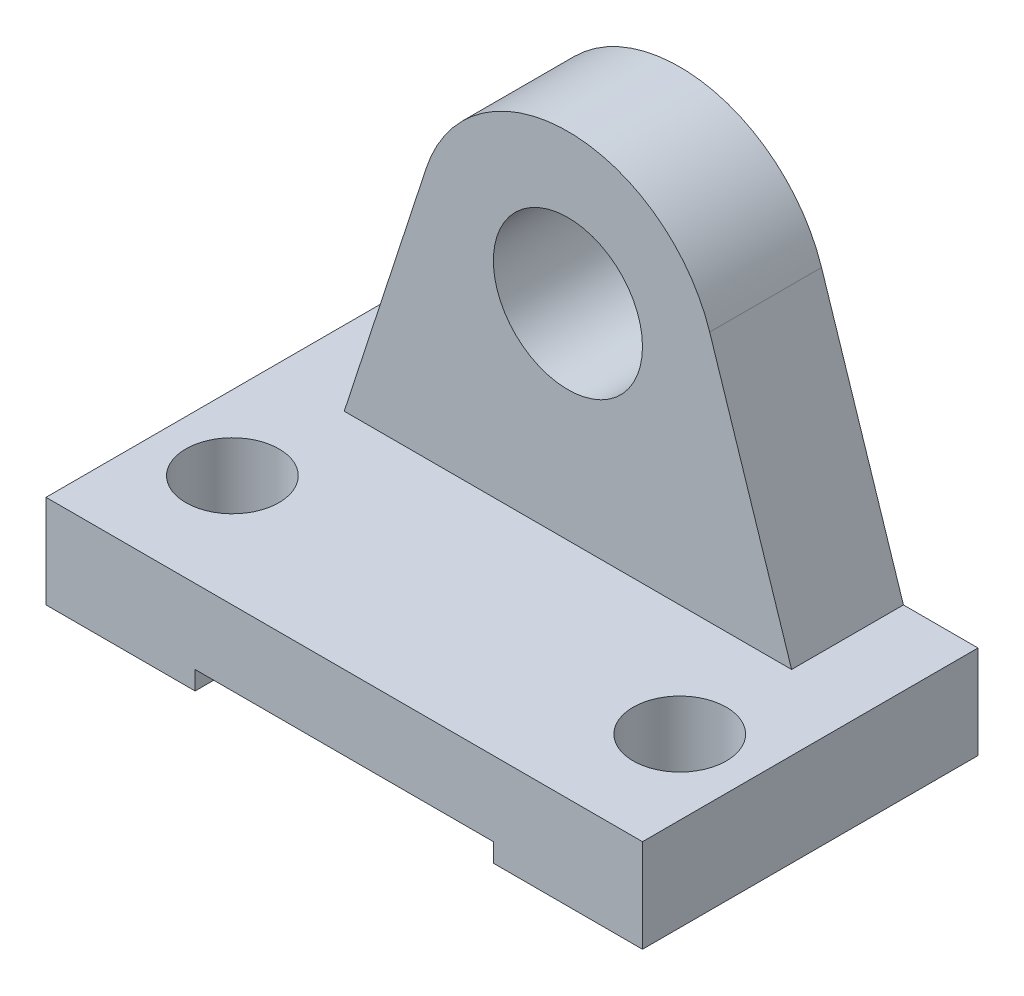
ISO-10303-21;
HEADER;
FILE_DESCRIPTION(('STEP AP214'),'2;1');
FILE_NAME('part.step','',(''),(''),'','','');
FILE_SCHEMA(('AUTOMOTIVE_DESIGN { 1 0 10303 214 1 1 1 1 }'));
ENDSEC;
DATA;
#1=APPLICATION_CONTEXT('core data for automotive mechanical design processes');
#2=APPLICATION_PROTOCOL_DEFINITION('international standard','automotive_design',2000,#1);
#3=PRODUCT_CONTEXT('',#1,'mechanical');
#4=PRODUCT('Part','Part','',(#3));
#5=PRODUCT_RELATED_PRODUCT_CATEGORY('part','',(#4));
#6=PRODUCT_DEFINITION_FORMATION('','',#4);
#7=PRODUCT_DEFINITION_CONTEXT('part definition',#1,'design');
#8=PRODUCT_DEFINITION('design','',#6,#7);
#9=PRODUCT_DEFINITION_SHAPE('','',#8);
#10=(LENGTH_UNIT() NAMED_UNIT(*) SI_UNIT(.MILLI.,.METRE.));
#11=(NAMED_UNIT(*) PLANE_ANGLE_UNIT() SI_UNIT($,.RADIAN.));
#12=(NAMED_UNIT(*) SI_UNIT($,.STERADIAN.) SOLID_ANGLE_UNIT());
#13=UNCERTAINTY_MEASURE_WITH_UNIT(LENGTH_MEASURE(1.E-05),#10,'distance_accuracy_value','');
#14=(GEOMETRIC_REPRESENTATION_CONTEXT(3) GLOBAL_UNCERTAINTY_ASSIGNED_CONTEXT((#13)) GLOBAL_UNIT_ASSIGNED_CONTEXT((#10,
#11,#12)) REPRESENTATION_CONTEXT('',''));
#15=CARTESIAN_POINT('',(0.,0.,0.));
#16=DIRECTION('',(0.,0.,1.));
#17=DIRECTION('',(1.,0.,0.));
#18=AXIS2_PLACEMENT_3D('',#15,#16,#17);
#19=CARTESIAN_POINT('',(-16.,4.,18.));
#20=DIRECTION('',(0.,1.,0.));
#21=DIRECTION('',(0.,0.,1.));
#22=AXIS2_PLACEMENT_3D('',#19,#20,#21);
#23=PLANE('',#22);
#24=CARTESIAN_POINT('',(12.,4.,12.));
#25=DIRECTION('',(0.,-1.,0.));
#26=DIRECTION('',(0.,0.,-1.));
#27=AXIS2_PLACEMENT_3D('',#24,#25,#26);
#28=CIRCLE('',#27,2.5);
#29=CARTESIAN_POINT('',(12.,4.,9.5));
#30=VERTEX_POINT('',#29);
#31=EDGE_CURVE('E352',#30,#30,#28,.T.);
#32=ORIENTED_EDGE('',*,*,#31,.T.);
#33=EDGE_LOOP('',(#32));
#34=FACE_BOUND('',#33,.T.);
#35=DIRECTION('',(0.,0.,-1.));
#36=VECTOR('',#35,1.);
#37=CARTESIAN_POINT('',(12.,4.,6.));
#38=LINE('',#37,#36);
#39=CARTESIAN_POINT('',(12.,4.,6.));
#40=VERTEX_POINT('',#39);
#41=CARTESIAN_POINT('',(12.,4.,0.));
#42=VERTEX_POINT('',#41);
#43=EDGE_CURVE('E401',#40,#42,#38,.T.);
#44=ORIENTED_EDGE('',*,*,#43,.F.);
#45=DIRECTION('',(1.,0.,0.));
#46=VECTOR('',#45,1.);
#47=CARTESIAN_POINT('',(0.,4.,6.));
#48=LINE('',#47,#46);
#49=CARTESIAN_POINT('',(-12.,4.,6.));
#50=VERTEX_POINT('',#49);
#51=EDGE_CURVE('E377',#50,#40,#48,.T.);
#52=ORIENTED_EDGE('',*,*,#51,.F.);
#53=DIRECTION('',(0.,0.,-1.));
#54=VECTOR('',#53,1.);
#55=CARTESIAN_POINT('',(-12.,4.,6.));
#56=LINE('',#55,#54);
#57=CARTESIAN_POINT('',(-12.,4.,0.));
#58=VERTEX_POINT('',#57);
#59=EDGE_CURVE('E211',#50,#58,#56,.T.);
#60=ORIENTED_EDGE('',*,*,#59,.T.);
#61=DIRECTION('',(1.,0.,0.));
#62=VECTOR('',#61,1.);
#63=CARTESIAN_POINT('',(-16.,4.,0.));
#64=LINE('',#63,#62);
#65=CARTESIAN_POINT('',(-16.,4.,0.));
#66=VERTEX_POINT('',#65);
#67=EDGE_CURVE('E167',#66,#58,#64,.T.);
#68=ORIENTED_EDGE('',*,*,#67,.F.);
#69=DIRECTION('',(0.,0.,-1.));
#70=VECTOR('',#69,1.);
#71=CARTESIAN_POINT('',(-16.,4.,18.));
#72=LINE('',#71,#70);
#73=CARTESIAN_POINT('',(-16.,4.,18.));
#74=VERTEX_POINT('',#73);
#75=EDGE_CURVE('E49',#74,#66,#72,.T.);
#76=ORIENTED_EDGE('',*,*,#75,.F.);
#77=DIRECTION('',(1.,0.,0.));
#78=VECTOR('',#77,1.);
#79=CARTESIAN_POINT('',(-16.,4.,18.));
#80=LINE('',#79,#78);
#81=CARTESIAN_POINT('',(16.,4.,18.));
#82=VERTEX_POINT('',#81);
#83=EDGE_CURVE('E411',#74,#82,#80,.T.);
#84=ORIENTED_EDGE('',*,*,#83,.T.);
#85=DIRECTION('',(0.,0.,-1.));
#86=VECTOR('',#85,1.);
#87=CARTESIAN_POINT('',(16.,4.,18.));
#88=LINE('',#87,#86);
#89=CARTESIAN_POINT('',(16.,4.,0.));
#90=VERTEX_POINT('',#89);
#91=EDGE_CURVE('E202',#82,#90,#88,.T.);
#92=ORIENTED_EDGE('',*,*,#91,.T.);
#93=EDGE_CURVE('E165',#42,#90,#64,.T.);
#94=ORIENTED_EDGE('',*,*,#93,.F.);
#95=EDGE_LOOP('',(#44,#52,#60,#68,#76,#84,#92,#94));
#96=FACE_BOUND('',#95,.T.);
#97=CARTESIAN_POINT('',(-12.,4.,12.));
#98=DIRECTION('',(0.,1.,0.));
#99=DIRECTION('',(0.,0.,1.));
#100=AXIS2_PLACEMENT_3D('',#97,#98,#99);
#101=CIRCLE('',#100,2.5);
#102=CARTESIAN_POINT('',(-12.,4.,14.5));
#103=VERTEX_POINT('',#102);
#104=EDGE_CURVE('E350',#103,#103,#101,.T.);
#105=ORIENTED_EDGE('',*,*,#104,.F.);
#106=EDGE_LOOP('',(#105));
#107=FACE_BOUND('',#106,.T.);
#108=ADVANCED_FACE('F45',(#34,#96,#107),#23,.T.);
#109=CARTESIAN_POINT('',(-16.,-1.,18.));
#110=DIRECTION('',(-1.,0.,0.));
#111=DIRECTION('',(0.,-1.,0.));
#112=AXIS2_PLACEMENT_3D('',#109,#110,#111);
#113=PLANE('',#112);
#114=DIRECTION('',(0.,1.,0.));
#115=VECTOR('',#114,1.);
#116=CARTESIAN_POINT('',(-16.,-1.,0.));
#117=LINE('',#116,#115);
#118=CARTESIAN_POINT('',(-16.,-1.,0.));
#119=VERTEX_POINT('',#118);
#120=EDGE_CURVE('E161',#119,#66,#117,.T.);
#121=ORIENTED_EDGE('',*,*,#120,.F.);
#122=DIRECTION('',(0.,0.,-1.));
#123=VECTOR('',#122,1.);
#124=CARTESIAN_POINT('',(-16.,-1.,18.));
#125=LINE('',#124,#123);
#126=CARTESIAN_POINT('',(-16.,-1.,18.));
#127=VERTEX_POINT('',#126);
#128=EDGE_CURVE('E11',#127,#119,#125,.T.);
#129=ORIENTED_EDGE('',*,*,#128,.F.);
#130=DIRECTION('',(0.,1.,0.));
#131=VECTOR('',#130,1.);
#132=CARTESIAN_POINT('',(-16.,-1.,18.));
#133=LINE('',#132,#131);
#134=EDGE_CURVE('E189',#127,#74,#133,.T.);
#135=ORIENTED_EDGE('',*,*,#134,.T.);
#136=ORIENTED_EDGE('',*,*,#75,.T.);
#137=EDGE_LOOP('',(#121,#129,#135,#136));
#138=FACE_BOUND('',#137,.T.);
#139=ADVANCED_FACE('F47',(#138),#113,.T.);
#140=CARTESIAN_POINT('',(-8.,-1.,18.));
#141=DIRECTION('',(0.,-1.,0.));
#142=DIRECTION('',(1.,0.,0.));
#143=AXIS2_PLACEMENT_3D('',#140,#141,#142);
#144=PLANE('',#143);
#145=CARTESIAN_POINT('',(-12.,-1.,12.));
#146=DIRECTION('',(0.,1.,0.));
#147=DIRECTION('',(0.,0.,1.));
#148=AXIS2_PLACEMENT_3D('',#145,#146,#147);
#149=CIRCLE('',#148,2.5);
#150=CARTESIAN_POINT('',(-12.,-1.,14.5));
#151=VERTEX_POINT('',#150);
#152=EDGE_CURVE('E347',#151,#151,#149,.T.);
#153=ORIENTED_EDGE('',*,*,#152,.T.);
#154=EDGE_LOOP('',(#153));
#155=FACE_BOUND('',#154,.T.);
#156=DIRECTION('',(-1.,0.,0.));
#157=VECTOR('',#156,1.);
#158=CARTESIAN_POINT('',(-8.,-1.,0.));
#159=LINE('',#158,#157);
#160=CARTESIAN_POINT('',(-8.,-1.,0.));
#161=VERTEX_POINT('',#160);
#162=EDGE_CURVE('E186',#161,#119,#159,.T.);
#163=ORIENTED_EDGE('',*,*,#162,.F.);
#164=DIRECTION('',(0.,0.,-1.));
#165=VECTOR('',#164,1.);
#166=CARTESIAN_POINT('',(-8.,-1.,18.));
#167=LINE('',#166,#165);
#168=CARTESIAN_POINT('',(-8.,-1.,18.));
#169=VERTEX_POINT('',#168);
#170=EDGE_CURVE('E55',#169,#161,#167,.T.);
#171=ORIENTED_EDGE('',*,*,#170,.F.);
#172=DIRECTION('',(-1.,0.,0.));
#173=VECTOR('',#172,1.);
#174=CARTESIAN_POINT('',(-8.,-1.,18.));
#175=LINE('',#174,#173);
#176=EDGE_CURVE('E146',#169,#127,#175,.T.);
#177=ORIENTED_EDGE('',*,*,#176,.T.);
#178=ORIENTED_EDGE('',*,*,#128,.T.);
#179=EDGE_LOOP('',(#163,#171,#177,#178));
#180=FACE_BOUND('',#179,.T.);
#181=ADVANCED_FACE('F215',(#155,#180),#144,.T.);
#182=CARTESIAN_POINT('',(-8.,0.,18.));
#183=DIRECTION('',(1.,0.,0.));
#184=DIRECTION('',(0.,0.,-1.));
#185=AXIS2_PLACEMENT_3D('',#182,#183,#184);
#186=PLANE('',#185);
#187=DIRECTION('',(0.,-1.,0.));
#188=VECTOR('',#187,1.);
#189=CARTESIAN_POINT('',(-8.,0.,0.));
#190=LINE('',#189,#188);
#191=CARTESIAN_POINT('',(-8.,0.,0.));
#192=VERTEX_POINT('',#191);
#193=EDGE_CURVE('E134',#192,#161,#190,.T.);
#194=ORIENTED_EDGE('',*,*,#193,.F.);
#195=DIRECTION('',(0.,0.,-1.));
#196=VECTOR('',#195,1.);
#197=CARTESIAN_POINT('',(-8.,0.,18.));
#198=LINE('',#197,#196);
#199=CARTESIAN_POINT('',(-8.,0.,18.));
#200=VERTEX_POINT('',#199);
#201=EDGE_CURVE('E128',#200,#192,#198,.T.);
#202=ORIENTED_EDGE('',*,*,#201,.F.);
#203=DIRECTION('',(0.,-1.,0.));
#204=VECTOR('',#203,1.);
#205=CARTESIAN_POINT('',(-8.,0.,18.));
#206=LINE('',#205,#204);
#207=EDGE_CURVE('E131',#200,#169,#206,.T.);
#208=ORIENTED_EDGE('',*,*,#207,.T.);
#209=ORIENTED_EDGE('',*,*,#170,.T.);
#210=EDGE_LOOP('',(#194,#202,#208,#209));
#211=FACE_BOUND('',#210,.T.);
#212=ADVANCED_FACE('F130',(#211),#186,.T.);
#213=CARTESIAN_POINT('',(8.,0.,18.));
#214=DIRECTION('',(0.,-1.,0.));
#215=DIRECTION('',(0.,0.,-1.));
#216=AXIS2_PLACEMENT_3D('',#213,#214,#215);
#217=PLANE('',#216);
#218=DIRECTION('',(-1.,0.,0.));
#219=VECTOR('',#218,1.);
#220=CARTESIAN_POINT('',(8.,0.,0.));
#221=LINE('',#220,#219);
#222=CARTESIAN_POINT('',(8.,0.,0.));
#223=VERTEX_POINT('',#222);
#224=EDGE_CURVE('E181',#223,#192,#221,.T.);
#225=ORIENTED_EDGE('',*,*,#224,.F.);
#226=DIRECTION('',(0.,0.,-1.));
#227=VECTOR('',#226,1.);
#228=CARTESIAN_POINT('',(8.,0.,18.));
#229=LINE('',#228,#227);
#230=CARTESIAN_POINT('',(8.,0.,18.));
#231=VERTEX_POINT('',#230);
#232=EDGE_CURVE('E140',#231,#223,#229,.T.);
#233=ORIENTED_EDGE('',*,*,#232,.F.);
#234=DIRECTION('',(-1.,0.,0.));
#235=VECTOR('',#234,1.);
#236=CARTESIAN_POINT('',(8.,0.,18.));
#237=LINE('',#236,#235);
#238=EDGE_CURVE('E145',#231,#200,#237,.T.);
#239=ORIENTED_EDGE('',*,*,#238,.T.);
#240=ORIENTED_EDGE('',*,*,#201,.T.);
#241=EDGE_LOOP('',(#225,#233,#239,#240));
#242=FACE_BOUND('',#241,.T.);
#243=ADVANCED_FACE('F149',(#242),#217,.T.);
#244=CARTESIAN_POINT('',(8.,0.,18.));
#245=DIRECTION('',(1.,0.,0.));
#246=DIRECTION('',(0.,0.,-1.));
#247=AXIS2_PLACEMENT_3D('',#244,#245,#246);
#248=PLANE('',#247);
#249=DIRECTION('',(0.,-1.,0.));
#250=VECTOR('',#249,1.);
#251=CARTESIAN_POINT('',(8.,0.,0.));
#252=LINE('',#251,#250);
#253=CARTESIAN_POINT('',(8.,-1.,0.));
#254=VERTEX_POINT('',#253);
#255=EDGE_CURVE('E178',#223,#254,#252,.T.);
#256=ORIENTED_EDGE('',*,*,#255,.T.);
#257=DIRECTION('',(0.,0.,-1.));
#258=VECTOR('',#257,1.);
#259=CARTESIAN_POINT('',(8.,-1.,18.));
#260=LINE('',#259,#258);
#261=CARTESIAN_POINT('',(8.,-1.,18.));
#262=VERTEX_POINT('',#261);
#263=EDGE_CURVE('E195',#262,#254,#260,.T.);
#264=ORIENTED_EDGE('',*,*,#263,.F.);
#265=DIRECTION('',(0.,-1.,0.));
#266=VECTOR('',#265,1.);
#267=CARTESIAN_POINT('',(8.,0.,18.));
#268=LINE('',#267,#266);
#269=EDGE_CURVE('E152',#231,#262,#268,.T.);
#270=ORIENTED_EDGE('',*,*,#269,.F.);
#271=ORIENTED_EDGE('',*,*,#232,.T.);
#272=EDGE_LOOP('',(#256,#264,#270,#271));
#273=FACE_BOUND('',#272,.T.);
#274=ADVANCED_FACE('F240',(#273),#248,.F.);
#275=CARTESIAN_POINT('',(8.,-1.,18.));
#276=DIRECTION('',(0.,1.,0.));
#277=DIRECTION('',(-1.,0.,0.));
#278=AXIS2_PLACEMENT_3D('',#275,#276,#277);
#279=PLANE('',#278);
#280=CARTESIAN_POINT('',(12.,-1.,12.));
#281=DIRECTION('',(0.,-1.,0.));
#282=DIRECTION('',(0.,0.,-1.));
#283=AXIS2_PLACEMENT_3D('',#280,#281,#282);
#284=CIRCLE('',#283,2.5);
#285=CARTESIAN_POINT('',(12.,-1.,9.5));
#286=VERTEX_POINT('',#285);
#287=EDGE_CURVE('E358',#286,#286,#284,.T.);
#288=ORIENTED_EDGE('',*,*,#287,.F.);
#289=EDGE_LOOP('',(#288));
#290=FACE_BOUND('',#289,.T.);
#291=DIRECTION('',(1.,0.,0.));
#292=VECTOR('',#291,1.);
#293=CARTESIAN_POINT('',(8.,-1.,0.));
#294=LINE('',#293,#292);
#295=CARTESIAN_POINT('',(16.,-1.,0.));
#296=VERTEX_POINT('',#295);
#297=EDGE_CURVE('E175',#254,#296,#294,.T.);
#298=ORIENTED_EDGE('',*,*,#297,.T.);
#299=DIRECTION('',(0.,0.,-1.));
#300=VECTOR('',#299,1.);
#301=CARTESIAN_POINT('',(16.,-1.,18.));
#302=LINE('',#301,#300);
#303=CARTESIAN_POINT('',(16.,-1.,18.));
#304=VERTEX_POINT('',#303);
#305=EDGE_CURVE('E199',#304,#296,#302,.T.);
#306=ORIENTED_EDGE('',*,*,#305,.F.);
#307=DIRECTION('',(1.,0.,0.));
#308=VECTOR('',#307,1.);
#309=CARTESIAN_POINT('',(8.,-1.,18.));
#310=LINE('',#309,#308);
#311=EDGE_CURVE('E155',#262,#304,#310,.T.);
#312=ORIENTED_EDGE('',*,*,#311,.F.);
#313=ORIENTED_EDGE('',*,*,#263,.T.);
#314=EDGE_LOOP('',(#298,#306,#312,#313));
#315=FACE_BOUND('',#314,.T.);
#316=ADVANCED_FACE('F237',(#290,#315),#279,.F.);
#317=CARTESIAN_POINT('',(16.,-1.,18.));
#318=DIRECTION('',(-1.,0.,0.));
#319=DIRECTION('',(0.,-1.,0.));
#320=AXIS2_PLACEMENT_3D('',#317,#318,#319);
#321=PLANE('',#320);
#322=DIRECTION('',(0.,1.,0.));
#323=VECTOR('',#322,1.);
#324=CARTESIAN_POINT('',(16.,-1.,0.));
#325=LINE('',#324,#323);
#326=EDGE_CURVE('E171',#296,#90,#325,.T.);
#327=ORIENTED_EDGE('',*,*,#326,.T.);
#328=ORIENTED_EDGE('',*,*,#91,.F.);
#329=DIRECTION('',(0.,1.,0.));
#330=VECTOR('',#329,1.);
#331=CARTESIAN_POINT('',(16.,-1.,18.));
#332=LINE('',#331,#330);
#333=EDGE_CURVE('E414',#304,#82,#332,.T.);
#334=ORIENTED_EDGE('',*,*,#333,.F.);
#335=ORIENTED_EDGE('',*,*,#305,.T.);
#336=EDGE_LOOP('',(#327,#328,#334,#335));
#337=FACE_BOUND('',#336,.T.);
#338=ADVANCED_FACE('F234',(#337),#321,.F.);
#339=CARTESIAN_POINT('',(0.,0.,18.));
#340=DIRECTION('',(0.,0.,-1.));
#341=DIRECTION('',(-1.,0.,0.));
#342=AXIS2_PLACEMENT_3D('',#339,#340,#341);
#343=PLANE('',#342);
#344=ORIENTED_EDGE('',*,*,#134,.F.);
#345=ORIENTED_EDGE('',*,*,#176,.F.);
#346=ORIENTED_EDGE('',*,*,#207,.F.);
#347=ORIENTED_EDGE('',*,*,#238,.F.);
#348=ORIENTED_EDGE('',*,*,#269,.T.);
#349=ORIENTED_EDGE('',*,*,#311,.T.);
#350=ORIENTED_EDGE('',*,*,#333,.T.);
#351=ORIENTED_EDGE('',*,*,#83,.F.);
#352=EDGE_LOOP('',(#344,#345,#346,#347,#348,#349,#350,#351));
#353=FACE_BOUND('',#352,.T.);
#354=ADVANCED_FACE('F144',(#353),#343,.F.);
#355=CARTESIAN_POINT('',(0.,0.,0.));
#356=DIRECTION('',(0.,0.,-1.));
#357=DIRECTION('',(-1.,0.,0.));
#358=AXIS2_PLACEMENT_3D('',#355,#356,#357);
#359=PLANE('',#358);
#360=ORIENTED_EDGE('',*,*,#120,.T.);
#361=ORIENTED_EDGE('',*,*,#67,.T.);
#362=DIRECTION('',(0.309922122811675,0.950761945910702,0.));
#363=VECTOR('',#362,1.);
#364=CARTESIAN_POINT('',(-12.0260279757637,3.92015281561483,0.));
#365=LINE('',#364,#363);
#366=CARTESIAN_POINT('',(-7.60609556728562,17.4793769824934,0.));
#367=VERTEX_POINT('',#366);
#368=EDGE_CURVE('E63',#58,#367,#365,.T.);
#369=ORIENTED_EDGE('',*,*,#368,.T.);
#370=CARTESIAN_POINT('',(0.,15.,0.));
#371=DIRECTION('',(0.,0.,1.));
#372=DIRECTION('',(1.,0.,0.));
#373=AXIS2_PLACEMENT_3D('',#370,#371,#372);
#374=CIRCLE('',#373,8.);
#375=CARTESIAN_POINT('',(7.60609556728562,17.4793769824934,0.));
#376=VERTEX_POINT('',#375);
#377=EDGE_CURVE('E389',#367,#376,#374,.F.);
#378=ORIENTED_EDGE('',*,*,#377,.T.);
#379=DIRECTION('',(-0.309922122811675,0.950761945910702,0.));
#380=VECTOR('',#379,1.);
#381=CARTESIAN_POINT('',(12.0260279757637,3.92015281561483,0.));
#382=LINE('',#381,#380);
#383=EDGE_CURVE('E369',#42,#376,#382,.T.);
#384=ORIENTED_EDGE('',*,*,#383,.F.);
#385=ORIENTED_EDGE('',*,*,#93,.T.);
#386=ORIENTED_EDGE('',*,*,#326,.F.);
#387=ORIENTED_EDGE('',*,*,#297,.F.);
#388=ORIENTED_EDGE('',*,*,#255,.F.);
#389=ORIENTED_EDGE('',*,*,#224,.T.);
#390=ORIENTED_EDGE('',*,*,#193,.T.);
#391=ORIENTED_EDGE('',*,*,#162,.T.);
#392=EDGE_LOOP('',(#360,#361,#369,#378,#384,#385,#386,#387,#388,#389,#390,#391));
#393=FACE_BOUND('',#392,.T.);
#394=CARTESIAN_POINT('',(0.,15.,0.));
#395=DIRECTION('',(0.,0.,1.));
#396=DIRECTION('',(1.,0.,0.));
#397=AXIS2_PLACEMENT_3D('',#394,#395,#396);
#398=CIRCLE('',#397,4.);
#399=CARTESIAN_POINT('',(4.,15.,0.));
#400=VERTEX_POINT('',#399);
#401=EDGE_CURVE('E356',#400,#400,#398,.T.);
#402=ORIENTED_EDGE('',*,*,#401,.T.);
#403=EDGE_LOOP('',(#402));
#404=FACE_BOUND('',#403,.T.);
#405=ADVANCED_FACE('F213',(#393,#404),#359,.T.);
#406=CARTESIAN_POINT('',(0.,15.,6.));
#407=DIRECTION('',(0.,0.,-1.));
#408=DIRECTION('',(-1.,0.,0.));
#409=AXIS2_PLACEMENT_3D('',#406,#407,#408);
#410=CYLINDRICAL_SURFACE('',#409,8.);
#411=ORIENTED_EDGE('',*,*,#377,.F.);
#412=DIRECTION('',(0.,0.,-1.));
#413=VECTOR('',#412,1.);
#414=CARTESIAN_POINT('',(-7.60609556728562,17.4793769824934,6.));
#415=LINE('',#414,#413);
#416=CARTESIAN_POINT('',(-7.60609556728562,17.4793769824934,6.));
#417=VERTEX_POINT('',#416);
#418=EDGE_CURVE('E166',#417,#367,#415,.T.);
#419=ORIENTED_EDGE('',*,*,#418,.F.);
#420=CARTESIAN_POINT('',(0.,15.,6.));
#421=DIRECTION('',(0.,0.,1.));
#422=DIRECTION('',(1.,0.,0.));
#423=AXIS2_PLACEMENT_3D('',#420,#421,#422);
#424=CIRCLE('',#423,8.);
#425=CARTESIAN_POINT('',(7.60609556728562,17.4793769824934,6.));
#426=VERTEX_POINT('',#425);
#427=EDGE_CURVE('E368',#417,#426,#424,.F.);
#428=ORIENTED_EDGE('',*,*,#427,.T.);
#429=DIRECTION('',(0.,0.,-1.));
#430=VECTOR('',#429,1.);
#431=CARTESIAN_POINT('',(7.60609556728562,17.4793769824934,6.));
#432=LINE('',#431,#430);
#433=EDGE_CURVE('E385',#426,#376,#432,.T.);
#434=ORIENTED_EDGE('',*,*,#433,.T.);
#435=EDGE_LOOP('',(#411,#419,#428,#434));
#436=FACE_BOUND('',#435,.T.);
#437=ADVANCED_FACE('F276',(#436),#410,.T.);
#438=CARTESIAN_POINT('',(-12.0260279757637,3.92015281561483,6.));
#439=DIRECTION('',(-0.950761945910702,0.309922122811675,0.));
#440=DIRECTION('',(-0.309922122811675,-0.950761945910702,0.));
#441=AXIS2_PLACEMENT_3D('',#438,#439,#440);
#442=PLANE('',#441);
#443=ORIENTED_EDGE('',*,*,#368,.F.);
#444=ORIENTED_EDGE('',*,*,#59,.F.);
#445=DIRECTION('',(0.309922122811675,0.950761945910702,0.));
#446=VECTOR('',#445,1.);
#447=CARTESIAN_POINT('',(-12.0260279757637,3.92015281561483,6.));
#448=LINE('',#447,#446);
#449=EDGE_CURVE('E373',#50,#417,#448,.T.);
#450=ORIENTED_EDGE('',*,*,#449,.T.);
#451=ORIENTED_EDGE('',*,*,#418,.T.);
#452=EDGE_LOOP('',(#443,#444,#450,#451));
#453=FACE_BOUND('',#452,.T.);
#454=ADVANCED_FACE('F282',(#453),#442,.T.);
#455=CARTESIAN_POINT('',(0.,15.,6.));
#456=DIRECTION('',(0.,0.,-1.));
#457=DIRECTION('',(-1.,0.,0.));
#458=AXIS2_PLACEMENT_3D('',#455,#456,#457);
#459=CYLINDRICAL_SURFACE('',#458,4.);
#460=CARTESIAN_POINT('',(0.,15.,6.));
#461=DIRECTION('',(0.,0.,1.));
#462=DIRECTION('',(1.,0.,0.));
#463=AXIS2_PLACEMENT_3D('',#460,#461,#462);
#464=CIRCLE('',#463,4.);
#465=CARTESIAN_POINT('',(4.,15.,6.));
#466=VERTEX_POINT('',#465);
#467=EDGE_CURVE('E364',#466,#466,#464,.T.);
#468=ORIENTED_EDGE('',*,*,#467,.T.);
#469=EDGE_LOOP('',(#468));
#470=FACE_BOUND('',#469,.T.);
#471=ORIENTED_EDGE('',*,*,#401,.F.);
#472=EDGE_LOOP('',(#471));
#473=FACE_BOUND('',#472,.T.);
#474=ADVANCED_FACE('F291',(#470,#473),#459,.F.);
#475=CARTESIAN_POINT('',(12.0260279757637,3.92015281561483,6.));
#476=DIRECTION('',(-0.950761945910702,-0.309922122811675,0.));
#477=DIRECTION('',(0.309922122811675,-0.950761945910702,0.));
#478=AXIS2_PLACEMENT_3D('',#475,#476,#477);
#479=PLANE('',#478);
#480=ORIENTED_EDGE('',*,*,#383,.T.);
#481=ORIENTED_EDGE('',*,*,#433,.F.);
#482=DIRECTION('',(-0.309922122811675,0.950761945910702,0.));
#483=VECTOR('',#482,1.);
#484=CARTESIAN_POINT('',(12.0260279757637,3.92015281561483,6.));
#485=LINE('',#484,#483);
#486=EDGE_CURVE('E381',#40,#426,#485,.T.);
#487=ORIENTED_EDGE('',*,*,#486,.F.);
#488=ORIENTED_EDGE('',*,*,#43,.T.);
#489=EDGE_LOOP('',(#480,#481,#487,#488));
#490=FACE_BOUND('',#489,.T.);
#491=ADVANCED_FACE('F299',(#490),#479,.F.);
#492=CARTESIAN_POINT('',(0.,0.,6.));
#493=DIRECTION('',(0.,0.,1.));
#494=DIRECTION('',(1.,0.,0.));
#495=AXIS2_PLACEMENT_3D('',#492,#493,#494);
#496=PLANE('',#495);
#497=ORIENTED_EDGE('',*,*,#467,.F.);
#498=EDGE_LOOP('',(#497));
#499=FACE_BOUND('',#498,.T.);
#500=ORIENTED_EDGE('',*,*,#427,.F.);
#501=ORIENTED_EDGE('',*,*,#449,.F.);
#502=ORIENTED_EDGE('',*,*,#51,.T.);
#503=ORIENTED_EDGE('',*,*,#486,.T.);
#504=EDGE_LOOP('',(#500,#501,#502,#503));
#505=FACE_BOUND('',#504,.T.);
#506=ADVANCED_FACE('F307',(#499,#505),#496,.T.);
#507=CARTESIAN_POINT('',(12.,-1.,12.));
#508=DIRECTION('',(0.,1.,0.));
#509=DIRECTION('',(0.,0.,1.));
#510=AXIS2_PLACEMENT_3D('',#507,#508,#509);
#511=CYLINDRICAL_SURFACE('',#510,2.5);
#512=ORIENTED_EDGE('',*,*,#287,.T.);
#513=EDGE_LOOP('',(#512));
#514=FACE_BOUND('',#513,.T.);
#515=ORIENTED_EDGE('',*,*,#31,.F.);
#516=EDGE_LOOP('',(#515));
#517=FACE_BOUND('',#516,.T.);
#518=ADVANCED_FACE('F315',(#514,#517),#511,.F.);
#519=CARTESIAN_POINT('',(-12.,-1.,12.));
#520=DIRECTION('',(0.,1.,0.));
#521=DIRECTION('',(0.,0.,1.));
#522=AXIS2_PLACEMENT_3D('',#519,#520,#521);
#523=CYLINDRICAL_SURFACE('',#522,2.5);
#524=ORIENTED_EDGE('',*,*,#152,.F.);
#525=EDGE_LOOP('',(#524));
#526=FACE_BOUND('',#525,.T.);
#527=ORIENTED_EDGE('',*,*,#104,.T.);
#528=EDGE_LOOP('',(#527));
#529=FACE_BOUND('',#528,.T.);
#530=ADVANCED_FACE('F332',(#526,#529),#523,.F.);
#531=CLOSED_SHELL('',(#108,#139,#181,#212,#243,#274,#316,#338,#354,#405,#437,#454,#474,#491,
#506,#518,#530));
#532=MANIFOLD_SOLID_BREP('B2',#531);
#533=ADVANCED_BREP_SHAPE_REPRESENTATION('',(#18,#532),#14);
#534=SHAPE_DEFINITION_REPRESENTATION(#9,#533);
ENDSEC;
END-ISO-10303-21;
